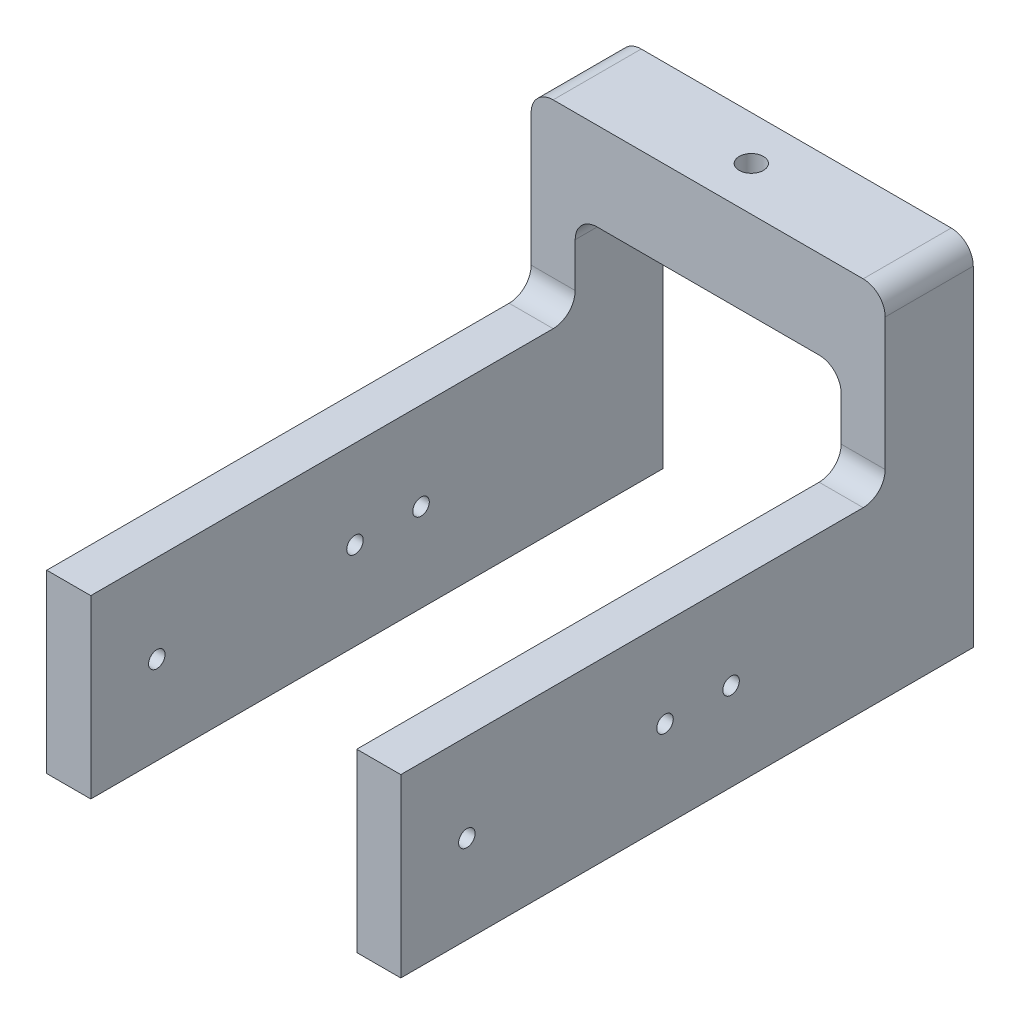
ISO-10303-21;
HEADER;
FILE_DESCRIPTION(('STEP AP214'),'2;1');
FILE_NAME('part.step','',(''),(''),'','','');
FILE_SCHEMA(('AUTOMOTIVE_DESIGN { 1 0 10303 214 1 1 1 1 }'));
ENDSEC;
DATA;
#1=APPLICATION_CONTEXT('core data for automotive mechanical design processes');
#2=APPLICATION_PROTOCOL_DEFINITION('international standard','automotive_design',2000,#1);
#3=PRODUCT_CONTEXT('',#1,'mechanical');
#4=PRODUCT('Part','Part','',(#3));
#5=PRODUCT_RELATED_PRODUCT_CATEGORY('part','',(#4));
#6=PRODUCT_DEFINITION_FORMATION('','',#4);
#7=PRODUCT_DEFINITION_CONTEXT('part definition',#1,'design');
#8=PRODUCT_DEFINITION('design','',#6,#7);
#9=PRODUCT_DEFINITION_SHAPE('','',#8);
#10=(LENGTH_UNIT() NAMED_UNIT(*) SI_UNIT(.MILLI.,.METRE.));
#11=(NAMED_UNIT(*) PLANE_ANGLE_UNIT() SI_UNIT($,.RADIAN.));
#12=(NAMED_UNIT(*) SI_UNIT($,.STERADIAN.) SOLID_ANGLE_UNIT());
#13=UNCERTAINTY_MEASURE_WITH_UNIT(LENGTH_MEASURE(1.E-05),#10,'distance_accuracy_value','');
#14=(GEOMETRIC_REPRESENTATION_CONTEXT(3) GLOBAL_UNCERTAINTY_ASSIGNED_CONTEXT((#13)) GLOBAL_UNIT_ASSIGNED_CONTEXT((#10,
#11,#12)) REPRESENTATION_CONTEXT('',''));
#15=CARTESIAN_POINT('',(0.,0.,0.));
#16=DIRECTION('',(0.,0.,1.));
#17=DIRECTION('',(1.,0.,0.));
#18=AXIS2_PLACEMENT_3D('',#15,#16,#17);
#19=CARTESIAN_POINT('',(102.108,101.6,25.3999999999999));
#20=DIRECTION('',(0.,-1.,0.));
#21=DIRECTION('',(0.,0.,-1.));
#22=AXIS2_PLACEMENT_3D('',#19,#20,#21);
#23=PLANE('',#22);
#24=DIRECTION('',(-1.,0.,0.));
#25=VECTOR('',#24,1.);
#26=CARTESIAN_POINT('',(102.108,101.6,25.3999999999999));
#27=LINE('',#26,#25);
#28=CARTESIAN_POINT('',(95.758,101.6,25.3999999999999));
#29=VERTEX_POINT('',#28);
#30=CARTESIAN_POINT('',(6.34999999999997,101.6,25.3999999999999));
#31=VERTEX_POINT('',#30);
#32=EDGE_CURVE('E214',#29,#31,#27,.T.);
#33=ORIENTED_EDGE('',*,*,#32,.F.);
#34=DIRECTION('',(0.,0.,1.));
#35=VECTOR('',#34,1.);
#36=CARTESIAN_POINT('',(95.758,101.6,25.3999999999999));
#37=LINE('',#36,#35);
#38=CARTESIAN_POINT('',(95.758,101.6,0.));
#39=VERTEX_POINT('',#38);
#40=EDGE_CURVE('E237',#29,#39,#37,.F.);
#41=ORIENTED_EDGE('',*,*,#40,.T.);
#42=DIRECTION('',(-1.,0.,0.));
#43=VECTOR('',#42,1.);
#44=CARTESIAN_POINT('',(102.108,101.6,0.));
#45=LINE('',#44,#43);
#46=CARTESIAN_POINT('',(6.34999999999997,101.6,0.));
#47=VERTEX_POINT('',#46);
#48=EDGE_CURVE('E217',#39,#47,#45,.T.);
#49=ORIENTED_EDGE('',*,*,#48,.T.);
#50=DIRECTION('',(0.,0.,1.));
#51=VECTOR('',#50,1.);
#52=CARTESIAN_POINT('',(6.34999999999997,101.6,25.3999999999999));
#53=LINE('',#52,#51);
#54=EDGE_CURVE('E234',#47,#31,#53,.T.);
#55=ORIENTED_EDGE('',*,*,#54,.T.);
#56=EDGE_LOOP('',(#33,#41,#49,#55));
#57=FACE_BOUND('',#56,.T.);
#58=CARTESIAN_POINT('',(50.8,101.6,12.7000000000002));
#59=DIRECTION('',(0.,1.,0.));
#60=DIRECTION('',(0.,0.,1.));
#61=AXIS2_PLACEMENT_3D('',#58,#59,#60);
#62=CIRCLE('',#61,3.49999999999999);
#63=CARTESIAN_POINT('',(50.8,101.6,16.2000000000001));
#64=VERTEX_POINT('',#63);
#65=EDGE_CURVE('E293',#64,#64,#62,.T.);
#66=ORIENTED_EDGE('',*,*,#65,.F.);
#67=EDGE_LOOP('',(#66));
#68=FACE_BOUND('',#67,.T.);
#69=ADVANCED_FACE('F49',(#57,#68),#23,.F.);
#70=CARTESIAN_POINT('',(102.108,50.8,165.1));
#71=DIRECTION('',(0.,-1.,0.));
#72=DIRECTION('',(0.,0.,-1.));
#73=AXIS2_PLACEMENT_3D('',#70,#71,#72);
#74=PLANE('',#73);
#75=DIRECTION('',(0.,0.,1.));
#76=VECTOR('',#75,1.);
#77=CARTESIAN_POINT('',(102.108,50.8,165.1));
#78=LINE('',#77,#76);
#79=CARTESIAN_POINT('',(102.108,50.8,31.7499999999999));
#80=VERTEX_POINT('',#79);
#81=CARTESIAN_POINT('',(102.108,50.8,165.1));
#82=VERTEX_POINT('',#81);
#83=EDGE_CURVE('E326',#80,#82,#78,.T.);
#84=ORIENTED_EDGE('',*,*,#83,.F.);
#85=DIRECTION('',(-1.,0.,0.));
#86=VECTOR('',#85,1.);
#87=CARTESIAN_POINT('',(89.4079999999999,50.8,31.7499999999999));
#88=LINE('',#87,#86);
#89=CARTESIAN_POINT('',(89.4079999999999,50.8,31.7499999999999));
#90=VERTEX_POINT('',#89);
#91=EDGE_CURVE('E257',#80,#90,#88,.T.);
#92=ORIENTED_EDGE('',*,*,#91,.T.);
#93=DIRECTION('',(0.,0.,1.));
#94=VECTOR('',#93,1.);
#95=CARTESIAN_POINT('',(89.4079999999998,50.8,165.1));
#96=LINE('',#95,#94);
#97=CARTESIAN_POINT('',(89.4079999999998,50.8,165.1));
#98=VERTEX_POINT('',#97);
#99=EDGE_CURVE('E313',#90,#98,#96,.T.);
#100=ORIENTED_EDGE('',*,*,#99,.T.);
#101=DIRECTION('',(-1.,0.,0.));
#102=VECTOR('',#101,1.);
#103=CARTESIAN_POINT('',(102.108,50.8,165.1));
#104=LINE('',#103,#102);
#105=EDGE_CURVE('E200',#82,#98,#104,.T.);
#106=ORIENTED_EDGE('',*,*,#105,.F.);
#107=EDGE_LOOP('',(#84,#92,#100,#106));
#108=FACE_BOUND('',#107,.T.);
#109=ADVANCED_FACE('F389',(#108),#74,.F.);
#110=CARTESIAN_POINT('',(102.108,0.,165.1));
#111=DIRECTION('',(0.,0.,-1.));
#112=DIRECTION('',(-1.,0.,0.));
#113=AXIS2_PLACEMENT_3D('',#110,#111,#112);
#114=PLANE('',#113);
#115=ORIENTED_EDGE('',*,*,#105,.T.);
#116=DIRECTION('',(0.,-1.,0.));
#117=VECTOR('',#116,1.);
#118=CARTESIAN_POINT('',(89.4079999999998,0.,165.1));
#119=LINE('',#118,#117);
#120=CARTESIAN_POINT('',(89.4079999999998,0.,165.1));
#121=VERTEX_POINT('',#120);
#122=EDGE_CURVE('E181',#98,#121,#119,.T.);
#123=ORIENTED_EDGE('',*,*,#122,.T.);
#124=DIRECTION('',(-1.,0.,0.));
#125=VECTOR('',#124,1.);
#126=CARTESIAN_POINT('',(102.108,0.,165.1));
#127=LINE('',#126,#125);
#128=CARTESIAN_POINT('',(102.108,0.,165.1));
#129=VERTEX_POINT('',#128);
#130=EDGE_CURVE('E197',#129,#121,#127,.T.);
#131=ORIENTED_EDGE('',*,*,#130,.F.);
#132=DIRECTION('',(0.,-1.,0.));
#133=VECTOR('',#132,1.);
#134=CARTESIAN_POINT('',(102.108,0.,165.1));
#135=LINE('',#134,#133);
#136=EDGE_CURVE('E328',#82,#129,#135,.T.);
#137=ORIENTED_EDGE('',*,*,#136,.F.);
#138=EDGE_LOOP('',(#115,#123,#131,#137));
#139=FACE_BOUND('',#138,.T.);
#140=ADVANCED_FACE('F195',(#139),#114,.F.);
#141=CARTESIAN_POINT('',(102.108,0.,0.));
#142=DIRECTION('',(0.,1.,0.));
#143=DIRECTION('',(0.,0.,1.));
#144=AXIS2_PLACEMENT_3D('',#141,#142,#143);
#145=PLANE('',#144);
#146=ORIENTED_EDGE('',*,*,#130,.T.);
#147=DIRECTION('',(0.,0.,-1.));
#148=VECTOR('',#147,1.);
#149=CARTESIAN_POINT('',(89.4079999999998,0.,165.1));
#150=LINE('',#149,#148);
#151=CARTESIAN_POINT('',(89.4079999999999,0.,0.));
#152=VERTEX_POINT('',#151);
#153=EDGE_CURVE('E176',#121,#152,#150,.T.);
#154=ORIENTED_EDGE('',*,*,#153,.T.);
#155=DIRECTION('',(-1.,0.,0.));
#156=VECTOR('',#155,1.);
#157=CARTESIAN_POINT('',(102.108,0.,0.));
#158=LINE('',#157,#156);
#159=CARTESIAN_POINT('',(102.108,0.,0.));
#160=VERTEX_POINT('',#159);
#161=EDGE_CURVE('E210',#160,#152,#158,.T.);
#162=ORIENTED_EDGE('',*,*,#161,.F.);
#163=DIRECTION('',(0.,0.,-1.));
#164=VECTOR('',#163,1.);
#165=CARTESIAN_POINT('',(102.108,0.,0.));
#166=LINE('',#165,#164);
#167=EDGE_CURVE('E204',#129,#160,#166,.T.);
#168=ORIENTED_EDGE('',*,*,#167,.F.);
#169=EDGE_LOOP('',(#146,#154,#162,#168));
#170=FACE_BOUND('',#169,.T.);
#171=ADVANCED_FACE('F203',(#170),#145,.F.);
#172=CARTESIAN_POINT('',(102.108,101.6,0.));
#173=DIRECTION('',(0.,0.,1.));
#174=DIRECTION('',(0.,-1.,0.));
#175=AXIS2_PLACEMENT_3D('',#172,#173,#174);
#176=PLANE('',#175);
#177=ORIENTED_EDGE('',*,*,#48,.F.);
#178=CARTESIAN_POINT('',(95.758,95.2500000000001,0.));
#179=DIRECTION('',(0.,0.,1.));
#180=DIRECTION('',(0.,-1.,0.));
#181=AXIS2_PLACEMENT_3D('',#178,#179,#180);
#182=CIRCLE('',#181,6.35);
#183=CARTESIAN_POINT('',(102.108,95.2500000000001,0.));
#184=VERTEX_POINT('',#183);
#185=EDGE_CURVE('E241',#39,#184,#182,.F.);
#186=ORIENTED_EDGE('',*,*,#185,.T.);
#187=DIRECTION('',(0.,1.,0.));
#188=VECTOR('',#187,1.);
#189=CARTESIAN_POINT('',(102.108,101.6,0.));
#190=LINE('',#189,#188);
#191=EDGE_CURVE('E319',#160,#184,#190,.T.);
#192=ORIENTED_EDGE('',*,*,#191,.F.);
#193=ORIENTED_EDGE('',*,*,#161,.T.);
#194=DIRECTION('',(0.,-1.,0.));
#195=VECTOR('',#194,1.);
#196=CARTESIAN_POINT('',(89.4079999999999,0.,0.));
#197=LINE('',#196,#195);
#198=CARTESIAN_POINT('',(89.4079999999999,69.85,0.));
#199=VERTEX_POINT('',#198);
#200=EDGE_CURVE('E185',#199,#152,#197,.T.);
#201=ORIENTED_EDGE('',*,*,#200,.F.);
#202=CARTESIAN_POINT('',(83.058,69.85,0.));
#203=DIRECTION('',(0.,0.,1.));
#204=DIRECTION('',(0.,-1.,0.));
#205=AXIS2_PLACEMENT_3D('',#202,#203,#204);
#206=CIRCLE('',#205,6.35);
#207=CARTESIAN_POINT('',(83.058,76.2,0.));
#208=VERTEX_POINT('',#207);
#209=EDGE_CURVE('E259',#199,#208,#206,.T.);
#210=ORIENTED_EDGE('',*,*,#209,.T.);
#211=DIRECTION('',(1.,0.,0.));
#212=VECTOR('',#211,1.);
#213=CARTESIAN_POINT('',(89.4079999999999,76.2,0.));
#214=LINE('',#213,#212);
#215=CARTESIAN_POINT('',(19.05,76.2,0.));
#216=VERTEX_POINT('',#215);
#217=EDGE_CURVE('E304',#216,#208,#214,.T.);
#218=ORIENTED_EDGE('',*,*,#217,.F.);
#219=CARTESIAN_POINT('',(19.05,69.85,0.));
#220=DIRECTION('',(0.,0.,1.));
#221=DIRECTION('',(0.,-1.,0.));
#222=AXIS2_PLACEMENT_3D('',#219,#220,#221);
#223=CIRCLE('',#222,6.35);
#224=CARTESIAN_POINT('',(12.7,69.85,2.22044604925031E-13));
#225=VERTEX_POINT('',#224);
#226=EDGE_CURVE('E263',#216,#225,#223,.T.);
#227=ORIENTED_EDGE('',*,*,#226,.T.);
#228=DIRECTION('',(0.,1.,0.));
#229=VECTOR('',#228,1.);
#230=CARTESIAN_POINT('',(12.7,76.2,2.22044604925031E-13));
#231=LINE('',#230,#229);
#232=CARTESIAN_POINT('',(12.6999999999999,0.,2.22044604925031E-13));
#233=VERTEX_POINT('',#232);
#234=EDGE_CURVE('E299',#233,#225,#231,.T.);
#235=ORIENTED_EDGE('',*,*,#234,.F.);
#236=CARTESIAN_POINT('',(0.,0.,0.));
#237=VERTEX_POINT('',#236);
#238=EDGE_CURVE('E331',#233,#237,#158,.T.);
#239=ORIENTED_EDGE('',*,*,#238,.T.);
#240=DIRECTION('',(0.,1.,0.));
#241=VECTOR('',#240,1.);
#242=CARTESIAN_POINT('',(0.,101.6,0.));
#243=LINE('',#242,#241);
#244=CARTESIAN_POINT('',(0.,95.2500000000001,0.));
#245=VERTEX_POINT('',#244);
#246=EDGE_CURVE('E318',#237,#245,#243,.T.);
#247=ORIENTED_EDGE('',*,*,#246,.T.);
#248=CARTESIAN_POINT('',(6.34999999999997,95.2500000000001,0.));
#249=DIRECTION('',(0.,0.,1.));
#250=DIRECTION('',(0.,-1.,0.));
#251=AXIS2_PLACEMENT_3D('',#248,#249,#250);
#252=CIRCLE('',#251,6.35);
#253=EDGE_CURVE('E239',#245,#47,#252,.F.);
#254=ORIENTED_EDGE('',*,*,#253,.T.);
#255=EDGE_LOOP('',(#177,#186,#192,#193,#201,#210,#218,#227,#235,#239,#247,#254));
#256=FACE_BOUND('',#255,.T.);
#257=ADVANCED_FACE('F357',(#256),#176,.F.);
#258=CARTESIAN_POINT('',(102.108,50.8,25.3999999999999));
#259=DIRECTION('',(0.,0.,-1.));
#260=DIRECTION('',(-1.,0.,0.));
#261=AXIS2_PLACEMENT_3D('',#258,#259,#260);
#262=PLANE('',#261);
#263=DIRECTION('',(0.,-1.,0.));
#264=VECTOR('',#263,1.);
#265=CARTESIAN_POINT('',(102.108,50.8,25.3999999999999));
#266=LINE('',#265,#264);
#267=CARTESIAN_POINT('',(102.108,95.2500000000001,25.3999999999999));
#268=VERTEX_POINT('',#267);
#269=CARTESIAN_POINT('',(102.108,57.15,25.3999999999999));
#270=VERTEX_POINT('',#269);
#271=EDGE_CURVE('E322',#268,#270,#266,.T.);
#272=ORIENTED_EDGE('',*,*,#271,.F.);
#273=CARTESIAN_POINT('',(95.758,95.2500000000001,25.3999999999999));
#274=DIRECTION('',(0.,0.,-1.));
#275=DIRECTION('',(-1.,0.,0.));
#276=AXIS2_PLACEMENT_3D('',#273,#274,#275);
#277=CIRCLE('',#276,6.35);
#278=EDGE_CURVE('E232',#268,#29,#277,.F.);
#279=ORIENTED_EDGE('',*,*,#278,.T.);
#280=ORIENTED_EDGE('',*,*,#32,.T.);
#281=CARTESIAN_POINT('',(6.34999999999997,95.2500000000001,25.3999999999999));
#282=DIRECTION('',(0.,0.,-1.));
#283=DIRECTION('',(-1.,0.,0.));
#284=AXIS2_PLACEMENT_3D('',#281,#282,#283);
#285=CIRCLE('',#284,6.35);
#286=CARTESIAN_POINT('',(0.,95.2500000000001,25.4000000000001));
#287=VERTEX_POINT('',#286);
#288=EDGE_CURVE('E230',#31,#287,#285,.F.);
#289=ORIENTED_EDGE('',*,*,#288,.T.);
#290=DIRECTION('',(0.,-1.,0.));
#291=VECTOR('',#290,1.);
#292=CARTESIAN_POINT('',(0.,50.8,25.4000000000001));
#293=LINE('',#292,#291);
#294=CARTESIAN_POINT('',(0.,57.15,25.4000000000001));
#295=VERTEX_POINT('',#294);
#296=EDGE_CURVE('E334',#287,#295,#293,.T.);
#297=ORIENTED_EDGE('',*,*,#296,.T.);
#298=DIRECTION('',(-1.,0.,0.));
#299=VECTOR('',#298,1.);
#300=CARTESIAN_POINT('',(12.7,57.15,25.4000000000001));
#301=LINE('',#300,#299);
#302=CARTESIAN_POINT('',(12.7,57.15,25.4000000000001));
#303=VERTEX_POINT('',#302);
#304=EDGE_CURVE('E228',#295,#303,#301,.F.);
#305=ORIENTED_EDGE('',*,*,#304,.T.);
#306=DIRECTION('',(0.,1.,0.));
#307=VECTOR('',#306,1.);
#308=CARTESIAN_POINT('',(12.7,50.8,25.4000000000001));
#309=LINE('',#308,#307);
#310=CARTESIAN_POINT('',(12.7,69.85,25.4000000000001));
#311=VERTEX_POINT('',#310);
#312=EDGE_CURVE('E310',#303,#311,#309,.T.);
#313=ORIENTED_EDGE('',*,*,#312,.T.);
#314=CARTESIAN_POINT('',(19.05,69.85,25.4000000000001));
#315=DIRECTION('',(0.,0.,-1.));
#316=DIRECTION('',(-1.,0.,0.));
#317=AXIS2_PLACEMENT_3D('',#314,#315,#316);
#318=CIRCLE('',#317,6.35);
#319=CARTESIAN_POINT('',(19.05,76.2,25.4000000000001));
#320=VERTEX_POINT('',#319);
#321=EDGE_CURVE('E265',#311,#320,#318,.T.);
#322=ORIENTED_EDGE('',*,*,#321,.T.);
#323=DIRECTION('',(1.,0.,0.));
#324=VECTOR('',#323,1.);
#325=CARTESIAN_POINT('',(102.108,76.2,25.3999999999999));
#326=LINE('',#325,#324);
#327=CARTESIAN_POINT('',(83.058,76.2,25.4000000000001));
#328=VERTEX_POINT('',#327);
#329=EDGE_CURVE('E220',#320,#328,#326,.T.);
#330=ORIENTED_EDGE('',*,*,#329,.T.);
#331=CARTESIAN_POINT('',(83.058,69.85,25.4000000000001));
#332=DIRECTION('',(0.,0.,-1.));
#333=DIRECTION('',(-1.,0.,0.));
#334=AXIS2_PLACEMENT_3D('',#331,#332,#333);
#335=CIRCLE('',#334,6.35);
#336=CARTESIAN_POINT('',(89.4079999999999,69.85,25.4000000000001));
#337=VERTEX_POINT('',#336);
#338=EDGE_CURVE('E261',#328,#337,#335,.T.);
#339=ORIENTED_EDGE('',*,*,#338,.T.);
#340=DIRECTION('',(0.,-1.,0.));
#341=VECTOR('',#340,1.);
#342=CARTESIAN_POINT('',(89.4079999999999,50.8,25.4000000000001));
#343=LINE('',#342,#341);
#344=CARTESIAN_POINT('',(89.4079999999999,57.15,25.4000000000001));
#345=VERTEX_POINT('',#344);
#346=EDGE_CURVE('E315',#337,#345,#343,.T.);
#347=ORIENTED_EDGE('',*,*,#346,.T.);
#348=DIRECTION('',(-1.,0.,0.));
#349=VECTOR('',#348,1.);
#350=CARTESIAN_POINT('',(102.108,57.15,25.3999999999999));
#351=LINE('',#350,#349);
#352=EDGE_CURVE('E226',#345,#270,#351,.F.);
#353=ORIENTED_EDGE('',*,*,#352,.T.);
#354=EDGE_LOOP('',(#272,#279,#280,#289,#297,#305,#313,#322,#330,#339,#347,#353));
#355=FACE_BOUND('',#354,.T.);
#356=ADVANCED_FACE('F368',(#355),#262,.F.);
#357=DIRECTION('',(0.,0.,-1.));
#358=VECTOR('',#357,1.);
#359=CARTESIAN_POINT('',(12.6999999999999,50.8,165.1));
#360=LINE('',#359,#358);
#361=CARTESIAN_POINT('',(12.6999999999999,50.8,165.1));
#362=VERTEX_POINT('',#361);
#363=CARTESIAN_POINT('',(12.7,50.8,31.7500000000002));
#364=VERTEX_POINT('',#363);
#365=EDGE_CURVE('E190',#362,#364,#360,.T.);
#366=ORIENTED_EDGE('',*,*,#365,.T.);
#367=DIRECTION('',(-1.,0.,0.));
#368=VECTOR('',#367,1.);
#369=CARTESIAN_POINT('',(0.,50.8,31.7499999999999));
#370=LINE('',#369,#368);
#371=CARTESIAN_POINT('',(0.,50.8,31.7499999999999));
#372=VERTEX_POINT('',#371);
#373=EDGE_CURVE('E254',#364,#372,#370,.T.);
#374=ORIENTED_EDGE('',*,*,#373,.T.);
#375=DIRECTION('',(0.,0.,1.));
#376=VECTOR('',#375,1.);
#377=CARTESIAN_POINT('',(-1.11022302462516E-13,50.8,165.1));
#378=LINE('',#377,#376);
#379=CARTESIAN_POINT('',(-1.11022302462516E-13,50.8,165.1));
#380=VERTEX_POINT('',#379);
#381=EDGE_CURVE('E337',#372,#380,#378,.T.);
#382=ORIENTED_EDGE('',*,*,#381,.T.);
#383=EDGE_CURVE('E205',#362,#380,#104,.T.);
#384=ORIENTED_EDGE('',*,*,#383,.F.);
#385=EDGE_LOOP('',(#366,#374,#382,#384));
#386=FACE_BOUND('',#385,.T.);
#387=ADVANCED_FACE('F409',(#386),#74,.F.);
#388=CARTESIAN_POINT('',(12.6999999999998,0.,165.1));
#389=VERTEX_POINT('',#388);
#390=CARTESIAN_POINT('',(-1.11022302462516E-13,0.,165.1));
#391=VERTEX_POINT('',#390);
#392=EDGE_CURVE('E206',#389,#391,#127,.T.);
#393=ORIENTED_EDGE('',*,*,#392,.F.);
#394=DIRECTION('',(0.,1.,0.));
#395=VECTOR('',#394,1.);
#396=CARTESIAN_POINT('',(12.6999999999999,76.2,165.1));
#397=LINE('',#396,#395);
#398=EDGE_CURVE('E201',#389,#362,#397,.T.);
#399=ORIENTED_EDGE('',*,*,#398,.T.);
#400=ORIENTED_EDGE('',*,*,#383,.T.);
#401=DIRECTION('',(0.,-1.,0.));
#402=VECTOR('',#401,1.);
#403=CARTESIAN_POINT('',(-1.11022302462516E-13,0.,165.1));
#404=LINE('',#403,#402);
#405=EDGE_CURVE('E339',#380,#391,#404,.T.);
#406=ORIENTED_EDGE('',*,*,#405,.T.);
#407=EDGE_LOOP('',(#393,#399,#400,#406));
#408=FACE_BOUND('',#407,.T.);
#409=ADVANCED_FACE('F434',(#408),#114,.F.);
#410=ORIENTED_EDGE('',*,*,#238,.F.);
#411=DIRECTION('',(0.,0.,-1.));
#412=VECTOR('',#411,1.);
#413=CARTESIAN_POINT('',(12.6999999999998,0.,165.1));
#414=LINE('',#413,#412);
#415=EDGE_CURVE('E191',#389,#233,#414,.T.);
#416=ORIENTED_EDGE('',*,*,#415,.F.);
#417=ORIENTED_EDGE('',*,*,#392,.T.);
#418=DIRECTION('',(0.,0.,-1.));
#419=VECTOR('',#418,1.);
#420=CARTESIAN_POINT('',(0.,0.,0.));
#421=LINE('',#420,#419);
#422=EDGE_CURVE('E323',#391,#237,#421,.T.);
#423=ORIENTED_EDGE('',*,*,#422,.T.);
#424=EDGE_LOOP('',(#410,#416,#417,#423));
#425=FACE_BOUND('',#424,.T.);
#426=ADVANCED_FACE('F346',(#425),#145,.F.);
#427=CARTESIAN_POINT('',(102.108,0.,0.));
#428=DIRECTION('',(-1.,0.,0.));
#429=DIRECTION('',(0.,0.,1.));
#430=AXIS2_PLACEMENT_3D('',#427,#428,#429);
#431=PLANE('',#430);
#432=CARTESIAN_POINT('',(102.108,25.3999999999999,146.05));
#433=DIRECTION('',(1.,0.,0.));
#434=DIRECTION('',(0.,0.,-1.));
#435=AXIS2_PLACEMENT_3D('',#432,#433,#434);
#436=CIRCLE('',#435,2.38125000000001);
#437=CARTESIAN_POINT('',(102.108,25.3999999999999,143.66875));
#438=VERTEX_POINT('',#437);
#439=EDGE_CURVE('E495',#438,#438,#436,.T.);
#440=ORIENTED_EDGE('',*,*,#439,.F.);
#441=EDGE_LOOP('',(#440));
#442=FACE_BOUND('',#441,.T.);
#443=CARTESIAN_POINT('',(102.108,25.3999999999999,88.9));
#444=DIRECTION('',(1.,0.,0.));
#445=DIRECTION('',(0.,0.,-1.));
#446=AXIS2_PLACEMENT_3D('',#443,#444,#445);
#447=CIRCLE('',#446,2.38125000000001);
#448=CARTESIAN_POINT('',(102.108,25.3999999999999,86.51875));
#449=VERTEX_POINT('',#448);
#450=EDGE_CURVE('E502',#449,#449,#447,.T.);
#451=ORIENTED_EDGE('',*,*,#450,.F.);
#452=EDGE_LOOP('',(#451));
#453=FACE_BOUND('',#452,.T.);
#454=CARTESIAN_POINT('',(102.108,25.3999999999999,69.85));
#455=DIRECTION('',(1.,0.,0.));
#456=DIRECTION('',(0.,0.,-1.));
#457=AXIS2_PLACEMENT_3D('',#454,#455,#456);
#458=CIRCLE('',#457,2.38125000000001);
#459=CARTESIAN_POINT('',(102.108,25.3999999999999,67.46875));
#460=VERTEX_POINT('',#459);
#461=EDGE_CURVE('E287',#460,#460,#458,.T.);
#462=ORIENTED_EDGE('',*,*,#461,.F.);
#463=EDGE_LOOP('',(#462));
#464=FACE_BOUND('',#463,.T.);
#465=ORIENTED_EDGE('',*,*,#191,.T.);
#466=DIRECTION('',(0.,0.,1.));
#467=VECTOR('',#466,1.);
#468=CARTESIAN_POINT('',(102.108,95.2500000000001,0.));
#469=LINE('',#468,#467);
#470=EDGE_CURVE('E223',#184,#268,#469,.T.);
#471=ORIENTED_EDGE('',*,*,#470,.T.);
#472=ORIENTED_EDGE('',*,*,#271,.T.);
#473=CARTESIAN_POINT('',(102.108,57.15,31.7499999999999));
#474=DIRECTION('',(-1.,0.,0.));
#475=DIRECTION('',(0.,0.,1.));
#476=AXIS2_PLACEMENT_3D('',#473,#474,#475);
#477=CIRCLE('',#476,6.35);
#478=EDGE_CURVE('E13',#270,#80,#477,.T.);
#479=ORIENTED_EDGE('',*,*,#478,.T.);
#480=ORIENTED_EDGE('',*,*,#83,.T.);
#481=ORIENTED_EDGE('',*,*,#136,.T.);
#482=ORIENTED_EDGE('',*,*,#167,.T.);
#483=EDGE_LOOP('',(#465,#471,#472,#479,#480,#481,#482));
#484=FACE_BOUND('',#483,.T.);
#485=ADVANCED_FACE('F374',(#442,#453,#464,#484),#431,.F.);
#486=CARTESIAN_POINT('',(0.,0.,0.));
#487=DIRECTION('',(-1.,0.,0.));
#488=DIRECTION('',(0.,0.,1.));
#489=AXIS2_PLACEMENT_3D('',#486,#487,#488);
#490=PLANE('',#489);
#491=CARTESIAN_POINT('',(-1.11022302462516E-13,25.3999999999999,146.05));
#492=DIRECTION('',(1.,0.,0.));
#493=DIRECTION('',(0.,0.,-1.));
#494=AXIS2_PLACEMENT_3D('',#491,#492,#493);
#495=CIRCLE('',#494,2.38125000000001);
#496=CARTESIAN_POINT('',(-1.11022302462516E-13,25.3999999999999,143.66875));
#497=VERTEX_POINT('',#496);
#498=EDGE_CURVE('E274',#497,#497,#495,.T.);
#499=ORIENTED_EDGE('',*,*,#498,.T.);
#500=EDGE_LOOP('',(#499));
#501=FACE_BOUND('',#500,.T.);
#502=CARTESIAN_POINT('',(0.,25.3999999999999,88.9));
#503=DIRECTION('',(1.,0.,0.));
#504=DIRECTION('',(0.,0.,-1.));
#505=AXIS2_PLACEMENT_3D('',#502,#503,#504);
#506=CIRCLE('',#505,2.38125000000001);
#507=CARTESIAN_POINT('',(0.,25.3999999999999,86.51875));
#508=VERTEX_POINT('',#507);
#509=EDGE_CURVE('E497',#508,#508,#506,.T.);
#510=ORIENTED_EDGE('',*,*,#509,.T.);
#511=EDGE_LOOP('',(#510));
#512=FACE_BOUND('',#511,.T.);
#513=CARTESIAN_POINT('',(-1.11022302462516E-13,25.3999999999999,69.85));
#514=DIRECTION('',(1.,0.,0.));
#515=DIRECTION('',(0.,0.,-1.));
#516=AXIS2_PLACEMENT_3D('',#513,#514,#515);
#517=CIRCLE('',#516,2.38125000000001);
#518=CARTESIAN_POINT('',(-1.11022302462516E-13,25.3999999999999,67.46875));
#519=VERTEX_POINT('',#518);
#520=EDGE_CURVE('E504',#519,#519,#517,.T.);
#521=ORIENTED_EDGE('',*,*,#520,.T.);
#522=EDGE_LOOP('',(#521));
#523=FACE_BOUND('',#522,.T.);
#524=ORIENTED_EDGE('',*,*,#296,.F.);
#525=DIRECTION('',(0.,0.,1.));
#526=VECTOR('',#525,1.);
#527=CARTESIAN_POINT('',(0.,95.2500000000001,0.));
#528=LINE('',#527,#526);
#529=EDGE_CURVE('E243',#287,#245,#528,.F.);
#530=ORIENTED_EDGE('',*,*,#529,.T.);
#531=ORIENTED_EDGE('',*,*,#246,.F.);
#532=ORIENTED_EDGE('',*,*,#422,.F.);
#533=ORIENTED_EDGE('',*,*,#405,.F.);
#534=ORIENTED_EDGE('',*,*,#381,.F.);
#535=CARTESIAN_POINT('',(0.,57.15,31.7499999999999));
#536=DIRECTION('',(-1.,0.,0.));
#537=DIRECTION('',(0.,0.,1.));
#538=AXIS2_PLACEMENT_3D('',#535,#536,#537);
#539=CIRCLE('',#538,6.35);
#540=EDGE_CURVE('E267',#372,#295,#539,.F.);
#541=ORIENTED_EDGE('',*,*,#540,.T.);
#542=EDGE_LOOP('',(#524,#530,#531,#532,#533,#534,#541));
#543=FACE_BOUND('',#542,.T.);
#544=ADVANCED_FACE('F352',(#501,#512,#523,#543),#490,.T.);
#545=CARTESIAN_POINT('',(89.4079999999998,76.2,165.1));
#546=DIRECTION('',(0.,1.,0.));
#547=DIRECTION('',(0.,0.,1.));
#548=AXIS2_PLACEMENT_3D('',#545,#546,#547);
#549=PLANE('',#548);
#550=CARTESIAN_POINT('',(50.8,76.2,12.7000000000002));
#551=DIRECTION('',(0.,1.,0.));
#552=DIRECTION('',(0.,0.,1.));
#553=AXIS2_PLACEMENT_3D('',#550,#551,#552);
#554=CIRCLE('',#553,3.49999999999999);
#555=CARTESIAN_POINT('',(50.8,76.2,16.2000000000001));
#556=VERTEX_POINT('',#555);
#557=EDGE_CURVE('E296',#556,#556,#554,.T.);
#558=ORIENTED_EDGE('',*,*,#557,.T.);
#559=EDGE_LOOP('',(#558));
#560=FACE_BOUND('',#559,.T.);
#561=ORIENTED_EDGE('',*,*,#217,.T.);
#562=DIRECTION('',(0.,0.,-1.));
#563=VECTOR('',#562,1.);
#564=CARTESIAN_POINT('',(83.058,76.2,25.4000000000001));
#565=LINE('',#564,#563);
#566=EDGE_CURVE('E250',#208,#328,#565,.F.);
#567=ORIENTED_EDGE('',*,*,#566,.T.);
#568=ORIENTED_EDGE('',*,*,#329,.F.);
#569=DIRECTION('',(0.,0.,-1.));
#570=VECTOR('',#569,1.);
#571=CARTESIAN_POINT('',(19.05,76.2,0.));
#572=LINE('',#571,#570);
#573=EDGE_CURVE('E247',#320,#216,#572,.T.);
#574=ORIENTED_EDGE('',*,*,#573,.T.);
#575=EDGE_LOOP('',(#561,#567,#568,#574));
#576=FACE_BOUND('',#575,.T.);
#577=ADVANCED_FACE('F382',(#560,#576),#549,.F.);
#578=CARTESIAN_POINT('',(89.4079999999998,0.,165.1));
#579=DIRECTION('',(1.,0.,0.));
#580=DIRECTION('',(0.,0.,-1.));
#581=AXIS2_PLACEMENT_3D('',#578,#579,#580);
#582=PLANE('',#581);
#583=CARTESIAN_POINT('',(89.4079999999998,25.3999999999999,146.05));
#584=DIRECTION('',(1.,0.,0.));
#585=DIRECTION('',(0.,0.,-1.));
#586=AXIS2_PLACEMENT_3D('',#583,#584,#585);
#587=CIRCLE('',#586,2.38125000000001);
#588=CARTESIAN_POINT('',(89.4079999999998,25.3999999999999,143.66875));
#589=VERTEX_POINT('',#588);
#590=EDGE_CURVE('E290',#589,#589,#587,.T.);
#591=ORIENTED_EDGE('',*,*,#590,.T.);
#592=EDGE_LOOP('',(#591));
#593=FACE_BOUND('',#592,.T.);
#594=CARTESIAN_POINT('',(89.4079999999999,25.3999999999999,88.9));
#595=DIRECTION('',(1.,0.,0.));
#596=DIRECTION('',(0.,0.,-1.));
#597=AXIS2_PLACEMENT_3D('',#594,#595,#596);
#598=CIRCLE('',#597,2.38125000000001);
#599=CARTESIAN_POINT('',(89.4079999999999,25.3999999999999,86.51875));
#600=VERTEX_POINT('',#599);
#601=EDGE_CURVE('E277',#600,#600,#598,.T.);
#602=ORIENTED_EDGE('',*,*,#601,.T.);
#603=EDGE_LOOP('',(#602));
#604=FACE_BOUND('',#603,.T.);
#605=CARTESIAN_POINT('',(89.4079999999998,25.3999999999999,69.85));
#606=DIRECTION('',(1.,0.,0.));
#607=DIRECTION('',(0.,0.,-1.));
#608=AXIS2_PLACEMENT_3D('',#605,#606,#607);
#609=CIRCLE('',#608,2.38125000000001);
#610=CARTESIAN_POINT('',(89.4079999999998,25.3999999999999,67.46875));
#611=VERTEX_POINT('',#610);
#612=EDGE_CURVE('E273',#611,#611,#609,.T.);
#613=ORIENTED_EDGE('',*,*,#612,.T.);
#614=EDGE_LOOP('',(#613));
#615=FACE_BOUND('',#614,.T.);
#616=ORIENTED_EDGE('',*,*,#346,.F.);
#617=DIRECTION('',(0.,0.,-1.));
#618=VECTOR('',#617,1.);
#619=CARTESIAN_POINT('',(89.4079999999999,69.85,0.));
#620=LINE('',#619,#618);
#621=EDGE_CURVE('E245',#337,#199,#620,.T.);
#622=ORIENTED_EDGE('',*,*,#621,.T.);
#623=ORIENTED_EDGE('',*,*,#200,.T.);
#624=ORIENTED_EDGE('',*,*,#153,.F.);
#625=ORIENTED_EDGE('',*,*,#122,.F.);
#626=ORIENTED_EDGE('',*,*,#99,.F.);
#627=CARTESIAN_POINT('',(89.4079999999999,57.15,31.7499999999999));
#628=DIRECTION('',(1.,0.,0.));
#629=DIRECTION('',(0.,0.,-1.));
#630=AXIS2_PLACEMENT_3D('',#627,#628,#629);
#631=CIRCLE('',#630,6.35);
#632=EDGE_CURVE('E58',#90,#345,#631,.T.);
#633=ORIENTED_EDGE('',*,*,#632,.T.);
#634=EDGE_LOOP('',(#616,#622,#623,#624,#625,#626,#633));
#635=FACE_BOUND('',#634,.T.);
#636=ADVANCED_FACE('F179',(#593,#604,#615,#635),#582,.F.);
#637=CARTESIAN_POINT('',(12.6999999999999,76.2,165.1));
#638=DIRECTION('',(-1.,0.,0.));
#639=DIRECTION('',(0.,-1.,0.));
#640=AXIS2_PLACEMENT_3D('',#637,#638,#639);
#641=PLANE('',#640);
#642=CARTESIAN_POINT('',(12.6999999999999,25.3999999999999,146.05));
#643=DIRECTION('',(-1.,0.,0.));
#644=DIRECTION('',(0.,-1.,0.));
#645=AXIS2_PLACEMENT_3D('',#642,#643,#644);
#646=CIRCLE('',#645,2.38125000000001);
#647=CARTESIAN_POINT('',(12.6999999999999,23.0187499999999,146.05));
#648=VERTEX_POINT('',#647);
#649=EDGE_CURVE('E53',#648,#648,#646,.T.);
#650=ORIENTED_EDGE('',*,*,#649,.T.);
#651=EDGE_LOOP('',(#650));
#652=FACE_BOUND('',#651,.T.);
#653=CARTESIAN_POINT('',(12.7,25.3999999999999,88.9000000000002));
#654=DIRECTION('',(-1.,0.,0.));
#655=DIRECTION('',(0.,-1.,0.));
#656=AXIS2_PLACEMENT_3D('',#653,#654,#655);
#657=CIRCLE('',#656,2.38125000000001);
#658=CARTESIAN_POINT('',(12.7,23.0187499999999,88.9000000000002));
#659=VERTEX_POINT('',#658);
#660=EDGE_CURVE('E275',#659,#659,#657,.T.);
#661=ORIENTED_EDGE('',*,*,#660,.T.);
#662=EDGE_LOOP('',(#661));
#663=FACE_BOUND('',#662,.T.);
#664=CARTESIAN_POINT('',(12.6999999999999,25.3999999999999,69.8500000000002));
#665=DIRECTION('',(-1.,0.,0.));
#666=DIRECTION('',(0.,-1.,0.));
#667=AXIS2_PLACEMENT_3D('',#664,#665,#666);
#668=CIRCLE('',#667,2.38125000000001);
#669=CARTESIAN_POINT('',(12.6999999999999,23.0187499999999,69.8500000000002));
#670=VERTEX_POINT('',#669);
#671=EDGE_CURVE('E271',#670,#670,#668,.T.);
#672=ORIENTED_EDGE('',*,*,#671,.T.);
#673=EDGE_LOOP('',(#672));
#674=FACE_BOUND('',#673,.T.);
#675=ORIENTED_EDGE('',*,*,#234,.T.);
#676=DIRECTION('',(0.,0.,-1.));
#677=VECTOR('',#676,1.);
#678=CARTESIAN_POINT('',(12.7,69.85,25.4000000000001));
#679=LINE('',#678,#677);
#680=EDGE_CURVE('E252',#225,#311,#679,.F.);
#681=ORIENTED_EDGE('',*,*,#680,.T.);
#682=ORIENTED_EDGE('',*,*,#312,.F.);
#683=CARTESIAN_POINT('',(12.7,57.15,31.7500000000002));
#684=DIRECTION('',(-1.,0.,0.));
#685=DIRECTION('',(0.,-1.,0.));
#686=AXIS2_PLACEMENT_3D('',#683,#684,#685);
#687=CIRCLE('',#686,6.35);
#688=EDGE_CURVE('E66',#303,#364,#687,.T.);
#689=ORIENTED_EDGE('',*,*,#688,.T.);
#690=ORIENTED_EDGE('',*,*,#365,.F.);
#691=ORIENTED_EDGE('',*,*,#398,.F.);
#692=ORIENTED_EDGE('',*,*,#415,.T.);
#693=EDGE_LOOP('',(#675,#681,#682,#689,#690,#691,#692));
#694=FACE_BOUND('',#693,.T.);
#695=ADVANCED_FACE('F428',(#652,#663,#674,#694),#641,.F.);
#696=CARTESIAN_POINT('',(50.8,101.6,12.7000000000002));
#697=DIRECTION('',(0.,1.,0.));
#698=DIRECTION('',(0.,0.,1.));
#699=AXIS2_PLACEMENT_3D('',#696,#697,#698);
#700=CYLINDRICAL_SURFACE('',#699,3.49999999999999);
#701=ORIENTED_EDGE('',*,*,#65,.T.);
#702=EDGE_LOOP('',(#701));
#703=FACE_BOUND('',#702,.T.);
#704=ORIENTED_EDGE('',*,*,#557,.F.);
#705=EDGE_LOOP('',(#704));
#706=FACE_BOUND('',#705,.T.);
#707=ADVANCED_FACE('F416',(#703,#706),#700,.F.);
#708=CARTESIAN_POINT('',(95.758,95.2500000000001,0.));
#709=DIRECTION('',(0.,0.,1.));
#710=DIRECTION('',(1.,0.,0.));
#711=AXIS2_PLACEMENT_3D('',#708,#709,#710);
#712=CYLINDRICAL_SURFACE('',#711,6.35);
#713=ORIENTED_EDGE('',*,*,#185,.F.);
#714=ORIENTED_EDGE('',*,*,#40,.F.);
#715=ORIENTED_EDGE('',*,*,#278,.F.);
#716=ORIENTED_EDGE('',*,*,#470,.F.);
#717=EDGE_LOOP('',(#713,#714,#715,#716));
#718=FACE_BOUND('',#717,.T.);
#719=ADVANCED_FACE('F372',(#718),#712,.T.);
#720=CARTESIAN_POINT('',(6.34999999999997,95.2500000000001,25.3999999999999));
#721=DIRECTION('',(0.,0.,-1.));
#722=DIRECTION('',(-1.,0.,0.));
#723=AXIS2_PLACEMENT_3D('',#720,#721,#722);
#724=CYLINDRICAL_SURFACE('',#723,6.35);
#725=ORIENTED_EDGE('',*,*,#253,.F.);
#726=ORIENTED_EDGE('',*,*,#529,.F.);
#727=ORIENTED_EDGE('',*,*,#288,.F.);
#728=ORIENTED_EDGE('',*,*,#54,.F.);
#729=EDGE_LOOP('',(#725,#726,#727,#728));
#730=FACE_BOUND('',#729,.T.);
#731=ADVANCED_FACE('F361',(#730),#724,.T.);
#732=CARTESIAN_POINT('',(83.0579999999999,69.85,165.1));
#733=DIRECTION('',(0.,0.,1.));
#734=DIRECTION('',(0.,-1.,0.));
#735=AXIS2_PLACEMENT_3D('',#732,#733,#734);
#736=CYLINDRICAL_SURFACE('',#735,6.35);
#737=ORIENTED_EDGE('',*,*,#338,.F.);
#738=ORIENTED_EDGE('',*,*,#566,.F.);
#739=ORIENTED_EDGE('',*,*,#209,.F.);
#740=ORIENTED_EDGE('',*,*,#621,.F.);
#741=EDGE_LOOP('',(#737,#738,#739,#740));
#742=FACE_BOUND('',#741,.T.);
#743=ADVANCED_FACE('F386',(#742),#736,.F.);
#744=CARTESIAN_POINT('',(19.0499999999999,69.85,165.1));
#745=DIRECTION('',(0.,0.,1.));
#746=DIRECTION('',(0.,-1.,0.));
#747=AXIS2_PLACEMENT_3D('',#744,#745,#746);
#748=CYLINDRICAL_SURFACE('',#747,6.35);
#749=ORIENTED_EDGE('',*,*,#321,.F.);
#750=ORIENTED_EDGE('',*,*,#680,.F.);
#751=ORIENTED_EDGE('',*,*,#226,.F.);
#752=ORIENTED_EDGE('',*,*,#573,.F.);
#753=EDGE_LOOP('',(#749,#750,#751,#752));
#754=FACE_BOUND('',#753,.T.);
#755=ADVANCED_FACE('F401',(#754),#748,.F.);
#756=CARTESIAN_POINT('',(102.108,57.15,31.7499999999999));
#757=DIRECTION('',(1.,0.,0.));
#758=DIRECTION('',(0.,0.,-1.));
#759=AXIS2_PLACEMENT_3D('',#756,#757,#758);
#760=CYLINDRICAL_SURFACE('',#759,6.35);
#761=ORIENTED_EDGE('',*,*,#688,.F.);
#762=ORIENTED_EDGE('',*,*,#304,.F.);
#763=ORIENTED_EDGE('',*,*,#540,.F.);
#764=ORIENTED_EDGE('',*,*,#373,.F.);
#765=EDGE_LOOP('',(#761,#762,#763,#764));
#766=FACE_BOUND('',#765,.T.);
#767=ADVANCED_FACE('F392',(#766),#760,.F.);
#768=CARTESIAN_POINT('',(102.108,57.15,31.7499999999999));
#769=DIRECTION('',(1.,0.,0.));
#770=DIRECTION('',(0.,0.,-1.));
#771=AXIS2_PLACEMENT_3D('',#768,#769,#770);
#772=CYLINDRICAL_SURFACE('',#771,6.35);
#773=ORIENTED_EDGE('',*,*,#478,.F.);
#774=ORIENTED_EDGE('',*,*,#352,.F.);
#775=ORIENTED_EDGE('',*,*,#632,.F.);
#776=ORIENTED_EDGE('',*,*,#91,.F.);
#777=EDGE_LOOP('',(#773,#774,#775,#776));
#778=FACE_BOUND('',#777,.T.);
#779=ADVANCED_FACE('F51',(#778),#772,.F.);
#780=CARTESIAN_POINT('',(-1.11022302462516E-13,25.3999999999999,69.85));
#781=DIRECTION('',(1.,0.,0.));
#782=DIRECTION('',(0.,0.,-1.));
#783=AXIS2_PLACEMENT_3D('',#780,#781,#782);
#784=CYLINDRICAL_SURFACE('',#783,2.38125000000001);
#785=ORIENTED_EDGE('',*,*,#520,.F.);
#786=EDGE_LOOP('',(#785));
#787=FACE_BOUND('',#786,.T.);
#788=ORIENTED_EDGE('',*,*,#671,.F.);
#789=EDGE_LOOP('',(#788));
#790=FACE_BOUND('',#789,.T.);
#791=ADVANCED_FACE('F391',(#787,#790),#784,.F.);
#792=CARTESIAN_POINT('',(0.,25.3999999999999,88.9));
#793=DIRECTION('',(1.,0.,0.));
#794=DIRECTION('',(0.,0.,-1.));
#795=AXIS2_PLACEMENT_3D('',#792,#793,#794);
#796=CYLINDRICAL_SURFACE('',#795,2.38125000000001);
#797=ORIENTED_EDGE('',*,*,#509,.F.);
#798=EDGE_LOOP('',(#797));
#799=FACE_BOUND('',#798,.T.);
#800=ORIENTED_EDGE('',*,*,#660,.F.);
#801=EDGE_LOOP('',(#800));
#802=FACE_BOUND('',#801,.T.);
#803=ADVANCED_FACE('F397',(#799,#802),#796,.F.);
#804=CARTESIAN_POINT('',(-1.11022302462516E-13,25.3999999999999,146.05));
#805=DIRECTION('',(1.,0.,0.));
#806=DIRECTION('',(0.,0.,-1.));
#807=AXIS2_PLACEMENT_3D('',#804,#805,#806);
#808=CYLINDRICAL_SURFACE('',#807,2.38125000000001);
#809=ORIENTED_EDGE('',*,*,#498,.F.);
#810=EDGE_LOOP('',(#809));
#811=FACE_BOUND('',#810,.T.);
#812=ORIENTED_EDGE('',*,*,#649,.F.);
#813=EDGE_LOOP('',(#812));
#814=FACE_BOUND('',#813,.T.);
#815=ADVANCED_FACE('F469',(#811,#814),#808,.F.);
#816=ORIENTED_EDGE('',*,*,#461,.T.);
#817=EDGE_LOOP('',(#816));
#818=FACE_BOUND('',#817,.T.);
#819=ORIENTED_EDGE('',*,*,#612,.F.);
#820=EDGE_LOOP('',(#819));
#821=FACE_BOUND('',#820,.T.);
#822=ADVANCED_FACE('F400',(#818,#821),#784,.F.);
#823=ORIENTED_EDGE('',*,*,#450,.T.);
#824=EDGE_LOOP('',(#823));
#825=FACE_BOUND('',#824,.T.);
#826=ORIENTED_EDGE('',*,*,#601,.F.);
#827=EDGE_LOOP('',(#826));
#828=FACE_BOUND('',#827,.T.);
#829=ADVANCED_FACE('F468',(#825,#828),#796,.F.);
#830=ORIENTED_EDGE('',*,*,#439,.T.);
#831=EDGE_LOOP('',(#830));
#832=FACE_BOUND('',#831,.T.);
#833=ORIENTED_EDGE('',*,*,#590,.F.);
#834=EDGE_LOOP('',(#833));
#835=FACE_BOUND('',#834,.T.);
#836=ADVANCED_FACE('F473',(#832,#835),#808,.F.);
#837=CLOSED_SHELL('',(#69,#109,#140,#171,#257,#356,#387,#409,#426,#485,#544,#577,#636,#695,#707,
#719,#731,#743,#755,#767,#779,#791,#803,#815,#822,#829,#836));
#838=MANIFOLD_SOLID_BREP('B2',#837);
#839=ADVANCED_BREP_SHAPE_REPRESENTATION('',(#18,#838),#14);
#840=SHAPE_DEFINITION_REPRESENTATION(#9,#839);
ENDSEC;
END-ISO-10303-21;
